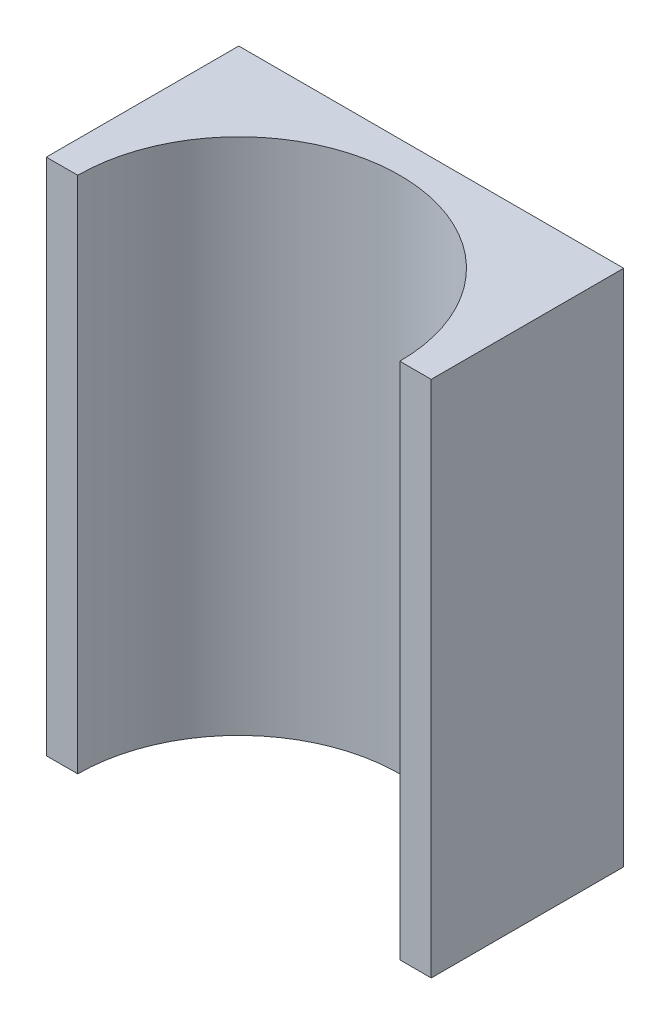
ISO-10303-21;
HEADER;
FILE_DESCRIPTION(('STEP AP214'),'2;1');
FILE_NAME('part.step','',(''),(''),'','','');
FILE_SCHEMA(('AUTOMOTIVE_DESIGN { 1 0 10303 214 1 1 1 1 }'));
ENDSEC;
DATA;
#1=APPLICATION_CONTEXT('core data for automotive mechanical design processes');
#2=APPLICATION_PROTOCOL_DEFINITION('international standard','automotive_design',2000,#1);
#3=PRODUCT_CONTEXT('',#1,'mechanical');
#4=PRODUCT('Part','Part','',(#3));
#5=PRODUCT_RELATED_PRODUCT_CATEGORY('part','',(#4));
#6=PRODUCT_DEFINITION_FORMATION('','',#4);
#7=PRODUCT_DEFINITION_CONTEXT('part definition',#1,'design');
#8=PRODUCT_DEFINITION('design','',#6,#7);
#9=PRODUCT_DEFINITION_SHAPE('','',#8);
#10=(LENGTH_UNIT() NAMED_UNIT(*) SI_UNIT(.MILLI.,.METRE.));
#11=(NAMED_UNIT(*) PLANE_ANGLE_UNIT() SI_UNIT($,.RADIAN.));
#12=(NAMED_UNIT(*) SI_UNIT($,.STERADIAN.) SOLID_ANGLE_UNIT());
#13=UNCERTAINTY_MEASURE_WITH_UNIT(LENGTH_MEASURE(1.E-05),#10,'distance_accuracy_value','');
#14=(GEOMETRIC_REPRESENTATION_CONTEXT(3) GLOBAL_UNCERTAINTY_ASSIGNED_CONTEXT((#13)) GLOBAL_UNIT_ASSIGNED_CONTEXT((#10,
#11,#12)) REPRESENTATION_CONTEXT('',''));
#15=CARTESIAN_POINT('',(0.,0.,0.));
#16=DIRECTION('',(0.,0.,1.));
#17=DIRECTION('',(1.,0.,0.));
#18=AXIS2_PLACEMENT_3D('',#15,#16,#17);
#19=CARTESIAN_POINT('',(0.,3352.8,0.));
#20=DIRECTION('',(0.,-1.,0.));
#21=DIRECTION('',(0.,0.,-1.));
#22=AXIS2_PLACEMENT_3D('',#19,#20,#21);
#23=CYLINDRICAL_SURFACE('',#22,1041.4);
#24=CARTESIAN_POINT('',(0.,0.,0.));
#25=DIRECTION('',(0.,-1.,0.));
#26=DIRECTION('',(0.,0.,-1.));
#27=AXIS2_PLACEMENT_3D('',#24,#25,#26);
#28=CIRCLE('',#27,1041.4);
#29=CARTESIAN_POINT('',(-1041.4,0.,0.));
#30=VERTEX_POINT('',#29);
#31=CARTESIAN_POINT('',(1041.4,0.,0.));
#32=VERTEX_POINT('',#31);
#33=EDGE_CURVE('E126',#30,#32,#28,.T.);
#34=ORIENTED_EDGE('',*,*,#33,.T.);
#35=DIRECTION('',(0.,-1.,0.));
#36=VECTOR('',#35,1.);
#37=CARTESIAN_POINT('',(1041.4,3352.8,0.));
#38=LINE('',#37,#36);
#39=CARTESIAN_POINT('',(1041.4,3352.8,0.));
#40=VERTEX_POINT('',#39);
#41=EDGE_CURVE('E11',#40,#32,#38,.T.);
#42=ORIENTED_EDGE('',*,*,#41,.F.);
#43=CARTESIAN_POINT('',(0.,3352.8,0.));
#44=DIRECTION('',(0.,-1.,0.));
#45=DIRECTION('',(0.,0.,-1.));
#46=AXIS2_PLACEMENT_3D('',#43,#44,#45);
#47=CIRCLE('',#46,1041.4);
#48=CARTESIAN_POINT('',(-1041.4,3352.8,0.));
#49=VERTEX_POINT('',#48);
#50=EDGE_CURVE('E144',#49,#40,#47,.T.);
#51=ORIENTED_EDGE('',*,*,#50,.F.);
#52=DIRECTION('',(0.,-1.,0.));
#53=VECTOR('',#52,1.);
#54=CARTESIAN_POINT('',(-1041.4,3352.8,0.));
#55=LINE('',#54,#53);
#56=EDGE_CURVE('E122',#49,#30,#55,.T.);
#57=ORIENTED_EDGE('',*,*,#56,.T.);
#58=EDGE_LOOP('',(#34,#42,#51,#57));
#59=FACE_BOUND('',#58,.T.);
#60=ADVANCED_FACE('F39',(#59),#23,.F.);
#61=CARTESIAN_POINT('',(1041.4,3352.8,0.));
#62=DIRECTION('',(0.,0.,-1.));
#63=DIRECTION('',(-1.,0.,0.));
#64=AXIS2_PLACEMENT_3D('',#61,#62,#63);
#65=PLANE('',#64);
#66=DIRECTION('',(1.,0.,0.));
#67=VECTOR('',#66,1.);
#68=CARTESIAN_POINT('',(1041.4,0.,0.));
#69=LINE('',#68,#67);
#70=CARTESIAN_POINT('',(1244.6,0.,0.));
#71=VERTEX_POINT('',#70);
#72=EDGE_CURVE('E130',#32,#71,#69,.T.);
#73=ORIENTED_EDGE('',*,*,#72,.T.);
#74=DIRECTION('',(0.,-1.,0.));
#75=VECTOR('',#74,1.);
#76=CARTESIAN_POINT('',(1244.6,3352.8,0.));
#77=LINE('',#76,#75);
#78=CARTESIAN_POINT('',(1244.6,3352.8,0.));
#79=VERTEX_POINT('',#78);
#80=EDGE_CURVE('E48',#79,#71,#77,.T.);
#81=ORIENTED_EDGE('',*,*,#80,.F.);
#82=DIRECTION('',(1.,0.,0.));
#83=VECTOR('',#82,1.);
#84=CARTESIAN_POINT('',(1041.4,3352.8,0.));
#85=LINE('',#84,#83);
#86=EDGE_CURVE('E89',#40,#79,#85,.T.);
#87=ORIENTED_EDGE('',*,*,#86,.F.);
#88=ORIENTED_EDGE('',*,*,#41,.T.);
#89=EDGE_LOOP('',(#73,#81,#87,#88));
#90=FACE_BOUND('',#89,.T.);
#91=ADVANCED_FACE('F172',(#90),#65,.F.);
#92=CARTESIAN_POINT('',(1244.6,3352.8,0.));
#93=DIRECTION('',(-1.,0.,0.));
#94=DIRECTION('',(0.,0.,1.));
#95=AXIS2_PLACEMENT_3D('',#92,#93,#94);
#96=PLANE('',#95);
#97=DIRECTION('',(0.,0.,-1.));
#98=VECTOR('',#97,1.);
#99=CARTESIAN_POINT('',(1244.6,0.,0.));
#100=LINE('',#99,#98);
#101=CARTESIAN_POINT('',(1244.6,0.,-1244.6));
#102=VERTEX_POINT('',#101);
#103=EDGE_CURVE('E133',#71,#102,#100,.T.);
#104=ORIENTED_EDGE('',*,*,#103,.T.);
#105=DIRECTION('',(0.,-1.,0.));
#106=VECTOR('',#105,1.);
#107=CARTESIAN_POINT('',(1244.6,3352.8,-1244.6));
#108=LINE('',#107,#106);
#109=CARTESIAN_POINT('',(1244.6,3352.8,-1244.6));
#110=VERTEX_POINT('',#109);
#111=EDGE_CURVE('E116',#110,#102,#108,.T.);
#112=ORIENTED_EDGE('',*,*,#111,.F.);
#113=DIRECTION('',(0.,0.,-1.));
#114=VECTOR('',#113,1.);
#115=CARTESIAN_POINT('',(1244.6,3352.8,0.));
#116=LINE('',#115,#114);
#117=EDGE_CURVE('E102',#79,#110,#116,.T.);
#118=ORIENTED_EDGE('',*,*,#117,.F.);
#119=ORIENTED_EDGE('',*,*,#80,.T.);
#120=EDGE_LOOP('',(#104,#112,#118,#119));
#121=FACE_BOUND('',#120,.T.);
#122=ADVANCED_FACE('F154',(#121),#96,.F.);
#123=CARTESIAN_POINT('',(-1244.6,3352.8,-1244.6));
#124=DIRECTION('',(0.,0.,-1.));
#125=DIRECTION('',(-1.,0.,0.));
#126=AXIS2_PLACEMENT_3D('',#123,#124,#125);
#127=PLANE('',#126);
#128=DIRECTION('',(1.,0.,0.));
#129=VECTOR('',#128,1.);
#130=CARTESIAN_POINT('',(-1244.6,0.,-1244.6));
#131=LINE('',#130,#129);
#132=CARTESIAN_POINT('',(-1244.6,0.,-1244.6));
#133=VERTEX_POINT('',#132);
#134=EDGE_CURVE('E111',#133,#102,#131,.T.);
#135=ORIENTED_EDGE('',*,*,#134,.F.);
#136=DIRECTION('',(0.,-1.,0.));
#137=VECTOR('',#136,1.);
#138=CARTESIAN_POINT('',(-1244.6,3352.8,-1244.6));
#139=LINE('',#138,#137);
#140=CARTESIAN_POINT('',(-1244.6,3352.8,-1244.6));
#141=VERTEX_POINT('',#140);
#142=EDGE_CURVE('E109',#141,#133,#139,.T.);
#143=ORIENTED_EDGE('',*,*,#142,.F.);
#144=DIRECTION('',(1.,0.,0.));
#145=VECTOR('',#144,1.);
#146=CARTESIAN_POINT('',(0.,3352.8,-1244.6));
#147=LINE('',#146,#145);
#148=EDGE_CURVE('E96',#141,#110,#147,.T.);
#149=ORIENTED_EDGE('',*,*,#148,.T.);
#150=ORIENTED_EDGE('',*,*,#111,.T.);
#151=EDGE_LOOP('',(#135,#143,#149,#150));
#152=FACE_BOUND('',#151,.T.);
#153=ADVANCED_FACE('F110',(#152),#127,.T.);
#154=CARTESIAN_POINT('',(-1244.6,3352.8,0.));
#155=DIRECTION('',(-1.,0.,0.));
#156=DIRECTION('',(0.,0.,1.));
#157=AXIS2_PLACEMENT_3D('',#154,#155,#156);
#158=PLANE('',#157);
#159=DIRECTION('',(0.,0.,-1.));
#160=VECTOR('',#159,1.);
#161=CARTESIAN_POINT('',(-1244.6,0.,0.));
#162=LINE('',#161,#160);
#163=CARTESIAN_POINT('',(-1244.6,0.,0.));
#164=VERTEX_POINT('',#163);
#165=EDGE_CURVE('E139',#164,#133,#162,.T.);
#166=ORIENTED_EDGE('',*,*,#165,.F.);
#167=DIRECTION('',(0.,-1.,0.));
#168=VECTOR('',#167,1.);
#169=CARTESIAN_POINT('',(-1244.6,3352.8,0.));
#170=LINE('',#169,#168);
#171=CARTESIAN_POINT('',(-1244.6,3352.8,0.));
#172=VERTEX_POINT('',#171);
#173=EDGE_CURVE('E78',#172,#164,#170,.T.);
#174=ORIENTED_EDGE('',*,*,#173,.F.);
#175=DIRECTION('',(0.,0.,-1.));
#176=VECTOR('',#175,1.);
#177=CARTESIAN_POINT('',(-1244.6,3352.8,0.));
#178=LINE('',#177,#176);
#179=EDGE_CURVE('E100',#172,#141,#178,.T.);
#180=ORIENTED_EDGE('',*,*,#179,.T.);
#181=ORIENTED_EDGE('',*,*,#142,.T.);
#182=EDGE_LOOP('',(#166,#174,#180,#181));
#183=FACE_BOUND('',#182,.T.);
#184=ADVANCED_FACE('F118',(#183),#158,.T.);
#185=CARTESIAN_POINT('',(-1244.6,3352.8,0.));
#186=DIRECTION('',(0.,0.,-1.));
#187=DIRECTION('',(-1.,0.,0.));
#188=AXIS2_PLACEMENT_3D('',#185,#186,#187);
#189=PLANE('',#188);
#190=DIRECTION('',(1.,0.,0.));
#191=VECTOR('',#190,1.);
#192=CARTESIAN_POINT('',(-1244.6,0.,0.));
#193=LINE('',#192,#191);
#194=EDGE_CURVE('E81',#164,#30,#193,.T.);
#195=ORIENTED_EDGE('',*,*,#194,.T.);
#196=ORIENTED_EDGE('',*,*,#56,.F.);
#197=DIRECTION('',(1.,0.,0.));
#198=VECTOR('',#197,1.);
#199=CARTESIAN_POINT('',(-1244.6,3352.8,0.));
#200=LINE('',#199,#198);
#201=EDGE_CURVE('E56',#172,#49,#200,.T.);
#202=ORIENTED_EDGE('',*,*,#201,.F.);
#203=ORIENTED_EDGE('',*,*,#173,.T.);
#204=EDGE_LOOP('',(#195,#196,#202,#203));
#205=FACE_BOUND('',#204,.T.);
#206=ADVANCED_FACE('F161',(#205),#189,.F.);
#207=CARTESIAN_POINT('',(0.,3352.8,0.));
#208=DIRECTION('',(0.,-1.,0.));
#209=DIRECTION('',(0.,0.,-1.));
#210=AXIS2_PLACEMENT_3D('',#207,#208,#209);
#211=PLANE('',#210);
#212=ORIENTED_EDGE('',*,*,#50,.T.);
#213=ORIENTED_EDGE('',*,*,#86,.T.);
#214=ORIENTED_EDGE('',*,*,#117,.T.);
#215=ORIENTED_EDGE('',*,*,#148,.F.);
#216=ORIENTED_EDGE('',*,*,#179,.F.);
#217=ORIENTED_EDGE('',*,*,#201,.T.);
#218=EDGE_LOOP('',(#212,#213,#214,#215,#216,#217));
#219=FACE_BOUND('',#218,.T.);
#220=ADVANCED_FACE('F98',(#219),#211,.F.);
#221=CARTESIAN_POINT('',(0.,0.,0.));
#222=DIRECTION('',(0.,-1.,0.));
#223=DIRECTION('',(0.,0.,-1.));
#224=AXIS2_PLACEMENT_3D('',#221,#222,#223);
#225=PLANE('',#224);
#226=ORIENTED_EDGE('',*,*,#33,.F.);
#227=ORIENTED_EDGE('',*,*,#194,.F.);
#228=ORIENTED_EDGE('',*,*,#165,.T.);
#229=ORIENTED_EDGE('',*,*,#134,.T.);
#230=ORIENTED_EDGE('',*,*,#103,.F.);
#231=ORIENTED_EDGE('',*,*,#72,.F.);
#232=EDGE_LOOP('',(#226,#227,#228,#229,#230,#231));
#233=FACE_BOUND('',#232,.T.);
#234=ADVANCED_FACE('F157',(#233),#225,.T.);
#235=CLOSED_SHELL('',(#60,#91,#122,#153,#184,#206,#220,#234));
#236=MANIFOLD_SOLID_BREP('B2',#235);
#237=ADVANCED_BREP_SHAPE_REPRESENTATION('',(#18,#236),#14);
#238=SHAPE_DEFINITION_REPRESENTATION(#9,#237);
ENDSEC;
END-ISO-10303-21;
